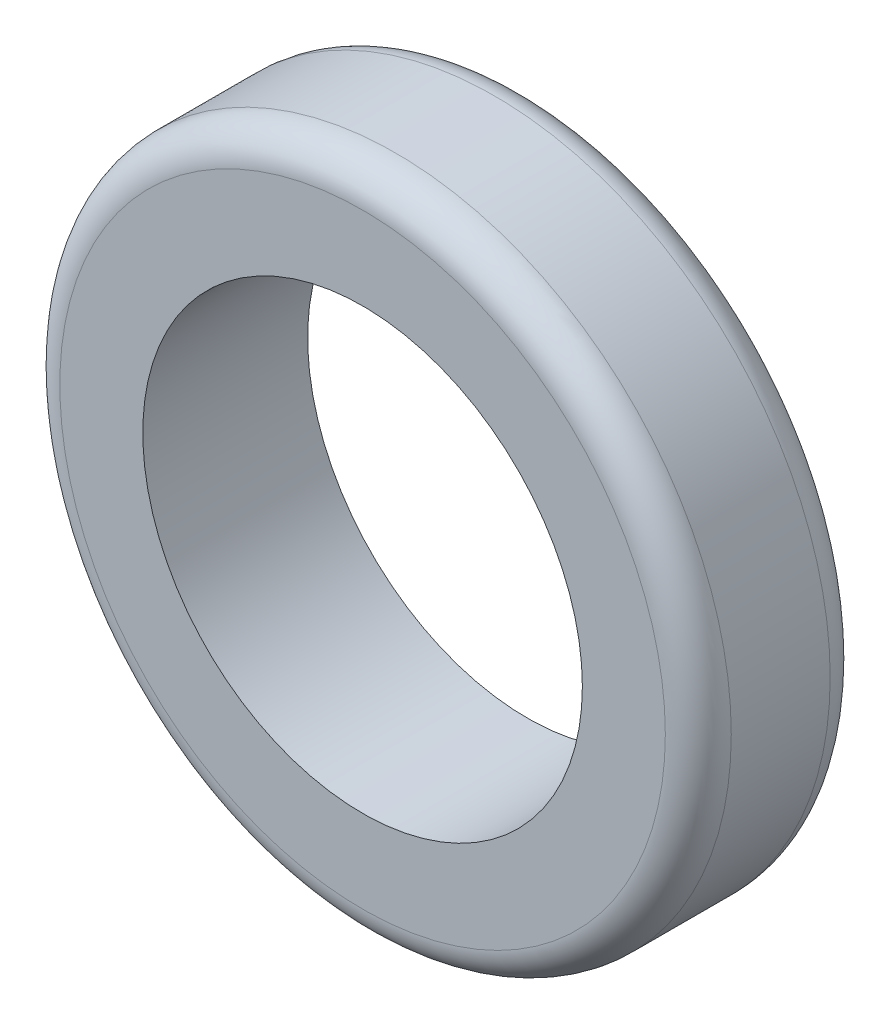
ISO-10303-21;
HEADER;
FILE_DESCRIPTION(('STEP AP214'),'2;1');
FILE_NAME('part.step','',(''),(''),'','','');
FILE_SCHEMA(('AUTOMOTIVE_DESIGN { 1 0 10303 214 1 1 1 1 }'));
ENDSEC;
DATA;
#1=APPLICATION_CONTEXT('core data for automotive mechanical design processes');
#2=APPLICATION_PROTOCOL_DEFINITION('international standard','automotive_design',2000,#1);
#3=PRODUCT_CONTEXT('',#1,'mechanical');
#4=PRODUCT('Part','Part','',(#3));
#5=PRODUCT_RELATED_PRODUCT_CATEGORY('part','',(#4));
#6=PRODUCT_DEFINITION_FORMATION('','',#4);
#7=PRODUCT_DEFINITION_CONTEXT('part definition',#1,'design');
#8=PRODUCT_DEFINITION('design','',#6,#7);
#9=PRODUCT_DEFINITION_SHAPE('','',#8);
#10=(LENGTH_UNIT() NAMED_UNIT(*) SI_UNIT(.MILLI.,.METRE.));
#11=(NAMED_UNIT(*) PLANE_ANGLE_UNIT() SI_UNIT($,.RADIAN.));
#12=(NAMED_UNIT(*) SI_UNIT($,.STERADIAN.) SOLID_ANGLE_UNIT());
#13=UNCERTAINTY_MEASURE_WITH_UNIT(LENGTH_MEASURE(1.E-05),#10,'distance_accuracy_value','');
#14=(GEOMETRIC_REPRESENTATION_CONTEXT(3) GLOBAL_UNCERTAINTY_ASSIGNED_CONTEXT((#13)) GLOBAL_UNIT_ASSIGNED_CONTEXT((#10,
#11,#12)) REPRESENTATION_CONTEXT('',''));
#15=CARTESIAN_POINT('',(0.,0.,0.));
#16=DIRECTION('',(0.,0.,1.));
#17=DIRECTION('',(1.,0.,0.));
#18=AXIS2_PLACEMENT_3D('',#15,#16,#17);
#19=CARTESIAN_POINT('',(0.,0.,15.));
#20=DIRECTION('',(0.,0.,1.));
#21=DIRECTION('',(1.,0.,0.));
#22=AXIS2_PLACEMENT_3D('',#19,#20,#21);
#23=PLANE('',#22);
#24=CARTESIAN_POINT('',(0.,0.,15.));
#25=DIRECTION('',(0.,0.,1.));
#26=DIRECTION('',(1.,0.,0.));
#27=AXIS2_PLACEMENT_3D('',#24,#25,#26);
#28=CIRCLE('',#27,27.55);
#29=CARTESIAN_POINT('',(27.55,0.,15.));
#30=VERTEX_POINT('',#29);
#31=EDGE_CURVE('E10',#30,#30,#28,.T.);
#32=ORIENTED_EDGE('',*,*,#31,.T.);
#33=EDGE_LOOP('',(#32));
#34=FACE_BOUND('',#33,.T.);
#35=CARTESIAN_POINT('',(0.,0.,15.));
#36=DIRECTION('',(0.,0.,1.));
#37=DIRECTION('',(1.,0.,0.));
#38=AXIS2_PLACEMENT_3D('',#35,#36,#37);
#39=CIRCLE('',#38,20.);
#40=CARTESIAN_POINT('',(20.,0.,15.));
#41=VERTEX_POINT('',#40);
#42=EDGE_CURVE('E55',#41,#41,#39,.T.);
#43=ORIENTED_EDGE('',*,*,#42,.F.);
#44=EDGE_LOOP('',(#43));
#45=FACE_BOUND('',#44,.T.);
#46=ADVANCED_FACE('F35',(#34,#45),#23,.T.);
#47=CARTESIAN_POINT('',(0.,0.,0.));
#48=DIRECTION('',(0.,0.,1.));
#49=DIRECTION('',(1.,0.,0.));
#50=AXIS2_PLACEMENT_3D('',#47,#48,#49);
#51=PLANE('',#50);
#52=CARTESIAN_POINT('',(0.,0.,0.));
#53=DIRECTION('',(0.,0.,1.));
#54=DIRECTION('',(1.,0.,0.));
#55=AXIS2_PLACEMENT_3D('',#52,#53,#54);
#56=CIRCLE('',#55,27.55);
#57=CARTESIAN_POINT('',(27.55,0.,0.));
#58=VERTEX_POINT('',#57);
#59=EDGE_CURVE('E42',#58,#58,#56,.F.);
#60=ORIENTED_EDGE('',*,*,#59,.T.);
#61=EDGE_LOOP('',(#60));
#62=FACE_BOUND('',#61,.T.);
#63=CARTESIAN_POINT('',(0.,0.,0.));
#64=DIRECTION('',(0.,0.,1.));
#65=DIRECTION('',(1.,0.,0.));
#66=AXIS2_PLACEMENT_3D('',#63,#64,#65);
#67=CIRCLE('',#66,20.);
#68=CARTESIAN_POINT('',(20.,0.,0.));
#69=VERTEX_POINT('',#68);
#70=EDGE_CURVE('E56',#69,#69,#67,.T.);
#71=ORIENTED_EDGE('',*,*,#70,.T.);
#72=EDGE_LOOP('',(#71));
#73=FACE_BOUND('',#72,.T.);
#74=ADVANCED_FACE('F66',(#62,#73),#51,.F.);
#75=CARTESIAN_POINT('',(0.,0.,15.));
#76=DIRECTION('',(0.,0.,-1.));
#77=DIRECTION('',(-1.,0.,0.));
#78=AXIS2_PLACEMENT_3D('',#75,#76,#77);
#79=CYLINDRICAL_SURFACE('',#78,30.55);
#80=CARTESIAN_POINT('',(0.,0.,3.));
#81=DIRECTION('',(0.,0.,1.));
#82=DIRECTION('',(1.,0.,0.));
#83=AXIS2_PLACEMENT_3D('',#80,#81,#82);
#84=CIRCLE('',#83,30.55);
#85=CARTESIAN_POINT('',(30.55,0.,3.));
#86=VERTEX_POINT('',#85);
#87=EDGE_CURVE('E46',#86,#86,#84,.T.);
#88=ORIENTED_EDGE('',*,*,#87,.T.);
#89=EDGE_LOOP('',(#88));
#90=FACE_BOUND('',#89,.T.);
#91=CARTESIAN_POINT('',(0.,0.,12.));
#92=DIRECTION('',(0.,0.,1.));
#93=DIRECTION('',(1.,0.,0.));
#94=AXIS2_PLACEMENT_3D('',#91,#92,#93);
#95=CIRCLE('',#94,30.55);
#96=CARTESIAN_POINT('',(30.55,0.,12.));
#97=VERTEX_POINT('',#96);
#98=EDGE_CURVE('E50',#97,#97,#95,.F.);
#99=ORIENTED_EDGE('',*,*,#98,.T.);
#100=EDGE_LOOP('',(#99));
#101=FACE_BOUND('',#100,.T.);
#102=ADVANCED_FACE('F71',(#90,#101),#79,.T.);
#103=CARTESIAN_POINT('',(0.,0.,15.));
#104=DIRECTION('',(0.,0.,-1.));
#105=DIRECTION('',(-1.,0.,0.));
#106=AXIS2_PLACEMENT_3D('',#103,#104,#105);
#107=CYLINDRICAL_SURFACE('',#106,20.);
#108=ORIENTED_EDGE('',*,*,#42,.T.);
#109=EDGE_LOOP('',(#108));
#110=FACE_BOUND('',#109,.T.);
#111=ORIENTED_EDGE('',*,*,#70,.F.);
#112=EDGE_LOOP('',(#111));
#113=FACE_BOUND('',#112,.T.);
#114=ADVANCED_FACE('F62',(#110,#113),#107,.F.);
#115=CARTESIAN_POINT('',(0.,0.,3.));
#116=DIRECTION('',(0.,0.,1.));
#117=DIRECTION('',(1.,0.,0.));
#118=AXIS2_PLACEMENT_3D('',#115,#116,#117);
#119=TOROIDAL_SURFACE('',#118,27.55,3.);
#120=ORIENTED_EDGE('',*,*,#59,.F.);
#121=EDGE_LOOP('',(#120));
#122=FACE_BOUND('',#121,.T.);
#123=ORIENTED_EDGE('',*,*,#87,.F.);
#124=EDGE_LOOP('',(#123));
#125=FACE_BOUND('',#124,.T.);
#126=ADVANCED_FACE('F77',(#122,#125),#119,.T.);
#127=CARTESIAN_POINT('',(0.,0.,12.));
#128=DIRECTION('',(0.,0.,1.));
#129=DIRECTION('',(1.,0.,0.));
#130=AXIS2_PLACEMENT_3D('',#127,#128,#129);
#131=TOROIDAL_SURFACE('',#130,27.55,3.);
#132=ORIENTED_EDGE('',*,*,#98,.F.);
#133=EDGE_LOOP('',(#132));
#134=FACE_BOUND('',#133,.T.);
#135=ORIENTED_EDGE('',*,*,#31,.F.);
#136=EDGE_LOOP('',(#135));
#137=FACE_BOUND('',#136,.T.);
#138=ADVANCED_FACE('F37',(#134,#137),#131,.T.);
#139=CLOSED_SHELL('',(#46,#74,#102,#114,#126,#138));
#140=MANIFOLD_SOLID_BREP('B2',#139);
#141=ADVANCED_BREP_SHAPE_REPRESENTATION('',(#18,#140),#14);
#142=SHAPE_DEFINITION_REPRESENTATION(#9,#141);
ENDSEC;
END-ISO-10303-21;
